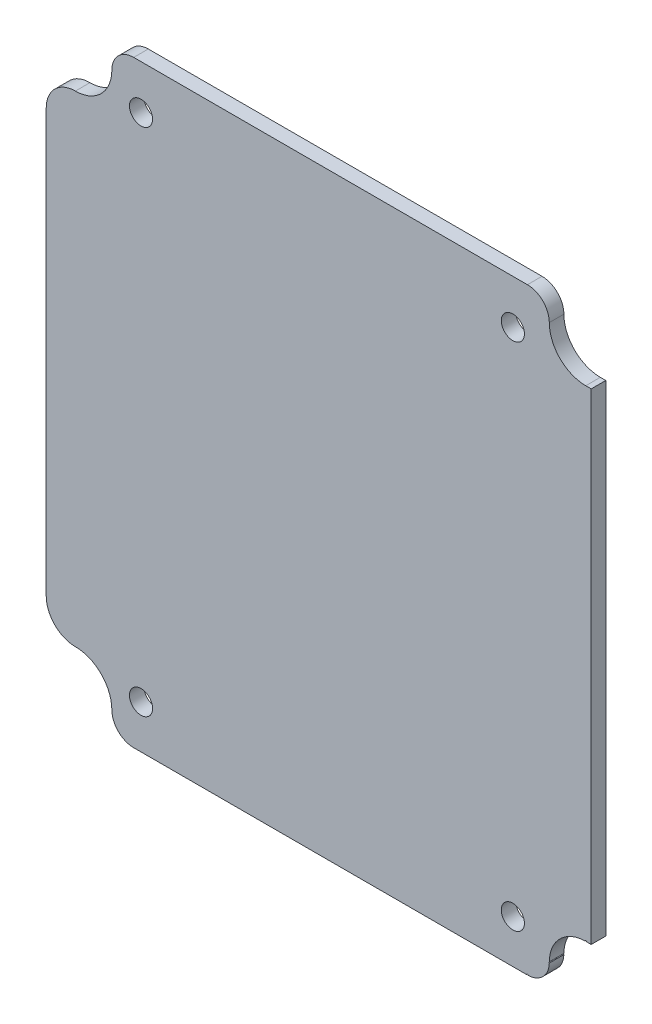
ISO-10303-21;
HEADER;
FILE_DESCRIPTION(('STEP AP214'),'2;1');
FILE_NAME('part.step','',(''),(''),'','','');
FILE_SCHEMA(('AUTOMOTIVE_DESIGN { 1 0 10303 214 1 1 1 1 }'));
ENDSEC;
DATA;
#1=APPLICATION_CONTEXT('core data for automotive mechanical design processes');
#2=APPLICATION_PROTOCOL_DEFINITION('international standard','automotive_design',2000,#1);
#3=PRODUCT_CONTEXT('',#1,'mechanical');
#4=PRODUCT('Part','Part','',(#3));
#5=PRODUCT_RELATED_PRODUCT_CATEGORY('part','',(#4));
#6=PRODUCT_DEFINITION_FORMATION('','',#4);
#7=PRODUCT_DEFINITION_CONTEXT('part definition',#1,'design');
#8=PRODUCT_DEFINITION('design','',#6,#7);
#9=PRODUCT_DEFINITION_SHAPE('','',#8);
#10=(LENGTH_UNIT() NAMED_UNIT(*) SI_UNIT(.MILLI.,.METRE.));
#11=(NAMED_UNIT(*) PLANE_ANGLE_UNIT() SI_UNIT($,.RADIAN.));
#12=(NAMED_UNIT(*) SI_UNIT($,.STERADIAN.) SOLID_ANGLE_UNIT());
#13=UNCERTAINTY_MEASURE_WITH_UNIT(LENGTH_MEASURE(1.E-05),#10,'distance_accuracy_value','');
#14=(GEOMETRIC_REPRESENTATION_CONTEXT(3) GLOBAL_UNCERTAINTY_ASSIGNED_CONTEXT((#13)) GLOBAL_UNIT_ASSIGNED_CONTEXT((#10,
#11,#12)) REPRESENTATION_CONTEXT('',''));
#15=CARTESIAN_POINT('',(0.,0.,0.));
#16=DIRECTION('',(0.,0.,1.));
#17=DIRECTION('',(1.,0.,0.));
#18=AXIS2_PLACEMENT_3D('',#15,#16,#17);
#19=CARTESIAN_POINT('',(-147.399894201283,992.021393519418,2.));
#20=DIRECTION('',(0.,0.,-1.));
#21=DIRECTION('',(-1.,0.,0.));
#22=AXIS2_PLACEMENT_3D('',#19,#20,#21);
#23=CYLINDRICAL_SURFACE('',#22,5.0001057650992);
#24=CARTESIAN_POINT('',(-147.399894201283,992.021393519418,0.));
#25=DIRECTION('',(0.,0.,1.));
#26=DIRECTION('',(1.,0.,0.));
#27=AXIS2_PLACEMENT_3D('',#24,#25,#26);
#28=CIRCLE('',#27,5.0001057650992);
#29=CARTESIAN_POINT('',(-152.399999962952,992.021208296758,0.));
#30=VERTEX_POINT('',#29);
#31=CARTESIAN_POINT('',(-147.399894201882,987.021287754318,0.));
#32=VERTEX_POINT('',#31);
#33=EDGE_CURVE('E215',#30,#32,#28,.T.);
#34=ORIENTED_EDGE('',*,*,#33,.F.);
#35=DIRECTION('',(0.,0.,-1.));
#36=VECTOR('',#35,1.);
#37=CARTESIAN_POINT('',(-152.399999962952,992.021208296758,2.));
#38=LINE('',#37,#36);
#39=CARTESIAN_POINT('',(-152.399999962952,992.021208296758,2.));
#40=VERTEX_POINT('',#39);
#41=EDGE_CURVE('E13',#40,#30,#38,.T.);
#42=ORIENTED_EDGE('',*,*,#41,.F.);
#43=CARTESIAN_POINT('',(-147.399894201283,992.021393519418,2.));
#44=DIRECTION('',(0.,0.,1.));
#45=DIRECTION('',(1.,0.,0.));
#46=AXIS2_PLACEMENT_3D('',#43,#44,#45);
#47=CIRCLE('',#46,5.0001057650992);
#48=CARTESIAN_POINT('',(-147.399894201882,987.021287754318,2.));
#49=VERTEX_POINT('',#48);
#50=EDGE_CURVE('E275',#40,#49,#47,.T.);
#51=ORIENTED_EDGE('',*,*,#50,.T.);
#52=DIRECTION('',(0.,0.,-1.));
#53=VECTOR('',#52,1.);
#54=CARTESIAN_POINT('',(-147.399894201882,987.021287754318,2.));
#55=LINE('',#54,#53);
#56=EDGE_CURVE('E58',#49,#32,#55,.T.);
#57=ORIENTED_EDGE('',*,*,#56,.T.);
#58=EDGE_LOOP('',(#34,#42,#51,#57));
#59=FACE_BOUND('',#58,.T.);
#60=ADVANCED_FACE('F42',(#59),#23,.F.);
#61=CARTESIAN_POINT('',(-155.400063419152,992.021208296758,2.));
#62=DIRECTION('',(0.,0.,-1.));
#63=DIRECTION('',(-1.,0.,0.));
#64=AXIS2_PLACEMENT_3D('',#61,#62,#63);
#65=CYLINDRICAL_SURFACE('',#64,3.00006345620052);
#66=CARTESIAN_POINT('',(-155.400063419152,992.021208296758,0.));
#67=DIRECTION('',(0.,0.,1.));
#68=DIRECTION('',(1.,0.,0.));
#69=AXIS2_PLACEMENT_3D('',#66,#67,#68);
#70=CIRCLE('',#69,3.00006345620052);
#71=CARTESIAN_POINT('',(-155.400063419152,995.021271752959,0.));
#72=VERTEX_POINT('',#71);
#73=EDGE_CURVE('E217',#30,#72,#70,.T.);
#74=ORIENTED_EDGE('',*,*,#73,.T.);
#75=DIRECTION('',(0.,0.,-1.));
#76=VECTOR('',#75,1.);
#77=CARTESIAN_POINT('',(-155.400063419152,995.021271752959,2.));
#78=LINE('',#77,#76);
#79=CARTESIAN_POINT('',(-155.400063419152,995.021271752959,2.));
#80=VERTEX_POINT('',#79);
#81=EDGE_CURVE('E50',#80,#72,#78,.T.);
#82=ORIENTED_EDGE('',*,*,#81,.F.);
#83=CARTESIAN_POINT('',(-155.400063419152,992.021208296758,2.));
#84=DIRECTION('',(0.,0.,1.));
#85=DIRECTION('',(1.,0.,0.));
#86=AXIS2_PLACEMENT_3D('',#83,#84,#85);
#87=CIRCLE('',#86,3.00006345620052);
#88=EDGE_CURVE('E335',#40,#80,#87,.T.);
#89=ORIENTED_EDGE('',*,*,#88,.F.);
#90=ORIENTED_EDGE('',*,*,#41,.T.);
#91=EDGE_LOOP('',(#74,#82,#89,#90));
#92=FACE_BOUND('',#91,.T.);
#93=ADVANCED_FACE('F381',(#92),#65,.T.);
#94=CARTESIAN_POINT('',(0.,995.021271752959,2.));
#95=DIRECTION('',(0.,-1.,0.));
#96=DIRECTION('',(0.,0.,-1.));
#97=AXIS2_PLACEMENT_3D('',#94,#95,#96);
#98=PLANE('',#97);
#99=DIRECTION('',(-1.,0.,0.));
#100=VECTOR('',#99,1.);
#101=CARTESIAN_POINT('',(0.,995.021271752959,0.));
#102=LINE('',#101,#100);
#103=CARTESIAN_POINT('',(-209.399816511665,995.021271752959,0.));
#104=VERTEX_POINT('',#103);
#105=EDGE_CURVE('E219',#72,#104,#102,.T.);
#106=ORIENTED_EDGE('',*,*,#105,.T.);
#107=DIRECTION('',(0.,0.,-1.));
#108=VECTOR('',#107,1.);
#109=CARTESIAN_POINT('',(-209.399816511665,995.021271752959,2.));
#110=LINE('',#109,#108);
#111=CARTESIAN_POINT('',(-209.399816511665,995.021271752959,2.));
#112=VERTEX_POINT('',#111);
#113=EDGE_CURVE('E306',#112,#104,#110,.T.);
#114=ORIENTED_EDGE('',*,*,#113,.F.);
#115=DIRECTION('',(-1.,0.,0.));
#116=VECTOR('',#115,1.);
#117=CARTESIAN_POINT('',(0.,995.021271752959,2.));
#118=LINE('',#117,#116);
#119=EDGE_CURVE('E315',#80,#112,#118,.T.);
#120=ORIENTED_EDGE('',*,*,#119,.F.);
#121=ORIENTED_EDGE('',*,*,#81,.T.);
#122=EDGE_LOOP('',(#106,#114,#120,#121));
#123=FACE_BOUND('',#122,.T.);
#124=ADVANCED_FACE('F313',(#123),#98,.F.);
#125=CARTESIAN_POINT('',(-209.399816511665,992.021208293899,2.));
#126=DIRECTION('',(0.,0.,-1.));
#127=DIRECTION('',(-1.,0.,0.));
#128=AXIS2_PLACEMENT_3D('',#125,#126,#127);
#129=CYLINDRICAL_SURFACE('',#128,3.00006345905935);
#130=CARTESIAN_POINT('',(-209.399816511665,992.021208293899,0.));
#131=DIRECTION('',(0.,0.,1.));
#132=DIRECTION('',(1.,0.,0.));
#133=AXIS2_PLACEMENT_3D('',#130,#131,#132);
#134=CIRCLE('',#133,3.00006345905935);
#135=CARTESIAN_POINT('',(-212.399879965007,992.021393513716,0.));
#136=VERTEX_POINT('',#135);
#137=EDGE_CURVE('E221',#104,#136,#134,.T.);
#138=ORIENTED_EDGE('',*,*,#137,.T.);
#139=DIRECTION('',(0.,0.,-1.));
#140=VECTOR('',#139,1.);
#141=CARTESIAN_POINT('',(-212.399879965007,992.021393513716,2.));
#142=LINE('',#141,#140);
#143=CARTESIAN_POINT('',(-212.399879965007,992.021393513716,2.));
#144=VERTEX_POINT('',#143);
#145=EDGE_CURVE('E304',#144,#136,#142,.T.);
#146=ORIENTED_EDGE('',*,*,#145,.F.);
#147=CARTESIAN_POINT('',(-209.399816511665,992.021208293899,2.));
#148=DIRECTION('',(0.,0.,1.));
#149=DIRECTION('',(1.,0.,0.));
#150=AXIS2_PLACEMENT_3D('',#147,#148,#149);
#151=CIRCLE('',#150,3.00006345905935);
#152=EDGE_CURVE('E329',#112,#144,#151,.T.);
#153=ORIENTED_EDGE('',*,*,#152,.F.);
#154=ORIENTED_EDGE('',*,*,#113,.T.);
#155=EDGE_LOOP('',(#138,#146,#153,#154));
#156=FACE_BOUND('',#155,.T.);
#157=ADVANCED_FACE('F326',(#156),#129,.T.);
#158=CARTESIAN_POINT('',(-217.39998572906,992.021393513716,2.));
#159=DIRECTION('',(0.,0.,-1.));
#160=DIRECTION('',(-1.,0.,0.));
#161=AXIS2_PLACEMENT_3D('',#158,#159,#160);
#162=CYLINDRICAL_SURFACE('',#161,5.00010576405378);
#163=CARTESIAN_POINT('',(-217.39998572906,992.021393513716,0.));
#164=DIRECTION('',(0.,0.,1.));
#165=DIRECTION('',(1.,0.,0.));
#166=AXIS2_PLACEMENT_3D('',#163,#164,#165);
#167=CIRCLE('',#166,5.00010576405378);
#168=CARTESIAN_POINT('',(-217.399777355045,987.021287754004,0.));
#169=VERTEX_POINT('',#168);
#170=EDGE_CURVE('E224',#169,#136,#167,.T.);
#171=ORIENTED_EDGE('',*,*,#170,.F.);
#172=DIRECTION('',(0.,0.,-1.));
#173=VECTOR('',#172,1.);
#174=CARTESIAN_POINT('',(-217.399777355045,987.021287754004,2.));
#175=LINE('',#174,#173);
#176=CARTESIAN_POINT('',(-217.399777355045,987.021287754004,2.));
#177=VERTEX_POINT('',#176);
#178=EDGE_CURVE('E302',#177,#169,#175,.T.);
#179=ORIENTED_EDGE('',*,*,#178,.F.);
#180=CARTESIAN_POINT('',(-217.39998572906,992.021393513716,2.));
#181=DIRECTION('',(0.,0.,1.));
#182=DIRECTION('',(1.,0.,0.));
#183=AXIS2_PLACEMENT_3D('',#180,#181,#182);
#184=CIRCLE('',#183,5.00010576405378);
#185=EDGE_CURVE('E331',#177,#144,#184,.T.);
#186=ORIENTED_EDGE('',*,*,#185,.T.);
#187=ORIENTED_EDGE('',*,*,#145,.T.);
#188=EDGE_LOOP('',(#171,#179,#186,#187));
#189=FACE_BOUND('',#188,.T.);
#190=ADVANCED_FACE('F392',(#189),#162,.F.);
#191=CARTESIAN_POINT('',(-217.399777355045,983.021203144638,2.));
#192=DIRECTION('',(0.,0.,-1.));
#193=DIRECTION('',(-1.,0.,0.));
#194=AXIS2_PLACEMENT_3D('',#191,#192,#193);
#195=CYLINDRICAL_SURFACE('',#194,4.0000846093656);
#196=CARTESIAN_POINT('',(-217.399777355045,983.021203144638,0.));
#197=DIRECTION('',(0.,0.,1.));
#198=DIRECTION('',(1.,0.,0.));
#199=AXIS2_PLACEMENT_3D('',#196,#197,#198);
#200=CIRCLE('',#199,4.0000846093656);
#201=CARTESIAN_POINT('',(-221.39986196441,983.021203144638,0.));
#202=VERTEX_POINT('',#201);
#203=EDGE_CURVE('E227',#169,#202,#200,.T.);
#204=ORIENTED_EDGE('',*,*,#203,.T.);
#205=DIRECTION('',(0.,0.,-1.));
#206=VECTOR('',#205,1.);
#207=CARTESIAN_POINT('',(-221.39986196441,983.021203144638,2.));
#208=LINE('',#207,#206);
#209=CARTESIAN_POINT('',(-221.39986196441,983.021203144638,2.));
#210=VERTEX_POINT('',#209);
#211=EDGE_CURVE('E299',#210,#202,#208,.T.);
#212=ORIENTED_EDGE('',*,*,#211,.F.);
#213=CARTESIAN_POINT('',(-217.399777355045,983.021203144638,2.));
#214=DIRECTION('',(0.,0.,1.));
#215=DIRECTION('',(1.,0.,0.));
#216=AXIS2_PLACEMENT_3D('',#213,#214,#215);
#217=CIRCLE('',#216,4.0000846093656);
#218=EDGE_CURVE('E333',#177,#210,#217,.T.);
#219=ORIENTED_EDGE('',*,*,#218,.F.);
#220=ORIENTED_EDGE('',*,*,#178,.T.);
#221=EDGE_LOOP('',(#204,#212,#219,#220));
#222=FACE_BOUND('',#221,.T.);
#223=ADVANCED_FACE('F395',(#222),#195,.T.);
#224=CARTESIAN_POINT('',(-221.39986196441,0.,2.));
#225=DIRECTION('',(1.,0.,0.));
#226=DIRECTION('',(0.,0.,-1.));
#227=AXIS2_PLACEMENT_3D('',#224,#225,#226);
#228=PLANE('',#227);
#229=DIRECTION('',(0.,-1.,0.));
#230=VECTOR('',#229,1.);
#231=CARTESIAN_POINT('',(-221.39986196441,0.,0.));
#232=LINE('',#231,#230);
#233=CARTESIAN_POINT('',(-221.39986196441,925.021411752362,0.));
#234=VERTEX_POINT('',#233);
#235=EDGE_CURVE('E229',#202,#234,#232,.T.);
#236=ORIENTED_EDGE('',*,*,#235,.T.);
#237=DIRECTION('',(0.,0.,-1.));
#238=VECTOR('',#237,1.);
#239=CARTESIAN_POINT('',(-221.39986196441,925.021411752362,2.));
#240=LINE('',#239,#238);
#241=CARTESIAN_POINT('',(-221.39986196441,925.021411752362,2.));
#242=VERTEX_POINT('',#241);
#243=EDGE_CURVE('E296',#242,#234,#240,.T.);
#244=ORIENTED_EDGE('',*,*,#243,.F.);
#245=DIRECTION('',(0.,-1.,0.));
#246=VECTOR('',#245,1.);
#247=CARTESIAN_POINT('',(-221.39986196441,0.,2.));
#248=LINE('',#247,#246);
#249=EDGE_CURVE('E340',#210,#242,#248,.T.);
#250=ORIENTED_EDGE('',*,*,#249,.F.);
#251=ORIENTED_EDGE('',*,*,#211,.T.);
#252=EDGE_LOOP('',(#236,#244,#250,#251));
#253=FACE_BOUND('',#252,.T.);
#254=ADVANCED_FACE('F399',(#253),#228,.F.);
#255=CARTESIAN_POINT('',(-217.399777356005,925.021504359014,2.));
#256=DIRECTION('',(0.,0.,-1.));
#257=DIRECTION('',(-1.,0.,0.));
#258=AXIS2_PLACEMENT_3D('',#255,#256,#257);
#259=CYLINDRICAL_SURFACE('',#258,4.00008460947704);
#260=CARTESIAN_POINT('',(-217.399777356005,925.021504359014,0.));
#261=DIRECTION('',(0.,0.,1.));
#262=DIRECTION('',(1.,0.,0.));
#263=AXIS2_PLACEMENT_3D('',#260,#261,#262);
#264=CIRCLE('',#263,4.00008460947704);
#265=CARTESIAN_POINT('',(-217.399735119561,921.02141974976,0.));
#266=VERTEX_POINT('',#265);
#267=EDGE_CURVE('E231',#234,#266,#264,.T.);
#268=ORIENTED_EDGE('',*,*,#267,.T.);
#269=DIRECTION('',(0.,0.,-1.));
#270=VECTOR('',#269,1.);
#271=CARTESIAN_POINT('',(-217.399735119561,921.02141974976,2.));
#272=LINE('',#271,#270);
#273=CARTESIAN_POINT('',(-217.399735119561,921.02141974976,2.));
#274=VERTEX_POINT('',#273);
#275=EDGE_CURVE('E294',#274,#266,#272,.T.);
#276=ORIENTED_EDGE('',*,*,#275,.F.);
#277=CARTESIAN_POINT('',(-217.399777356005,925.021504359014,2.));
#278=DIRECTION('',(0.,0.,1.));
#279=DIRECTION('',(1.,0.,0.));
#280=AXIS2_PLACEMENT_3D('',#277,#278,#279);
#281=CIRCLE('',#280,4.00008460947704);
#282=EDGE_CURVE('E342',#242,#274,#281,.T.);
#283=ORIENTED_EDGE('',*,*,#282,.F.);
#284=ORIENTED_EDGE('',*,*,#243,.T.);
#285=EDGE_LOOP('',(#268,#276,#283,#284));
#286=FACE_BOUND('',#285,.T.);
#287=ADVANCED_FACE('F403',(#286),#259,.T.);
#288=CARTESIAN_POINT('',(-217.399985728681,916.021313993188,2.));
#289=DIRECTION('',(0.,0.,-1.));
#290=DIRECTION('',(-1.,0.,0.));
#291=AXIS2_PLACEMENT_3D('',#288,#289,#290);
#292=CYLINDRICAL_SURFACE('',#291,5.00010576285206);
#293=CARTESIAN_POINT('',(-217.399985728681,916.021313993188,0.));
#294=DIRECTION('',(0.,0.,1.));
#295=DIRECTION('',(1.,0.,0.));
#296=AXIS2_PLACEMENT_3D('',#293,#294,#295);
#297=CIRCLE('',#296,5.00010576285206);
#298=CARTESIAN_POINT('',(-212.399879965829,916.021313993188,0.));
#299=VERTEX_POINT('',#298);
#300=EDGE_CURVE('E234',#299,#266,#297,.T.);
#301=ORIENTED_EDGE('',*,*,#300,.F.);
#302=DIRECTION('',(0.,0.,-1.));
#303=VECTOR('',#302,1.);
#304=CARTESIAN_POINT('',(-212.399879965829,916.021313993188,2.));
#305=LINE('',#304,#303);
#306=CARTESIAN_POINT('',(-212.399879965829,916.021313993188,2.));
#307=VERTEX_POINT('',#306);
#308=EDGE_CURVE('E292',#307,#299,#305,.T.);
#309=ORIENTED_EDGE('',*,*,#308,.F.);
#310=CARTESIAN_POINT('',(-217.399985728681,916.021313993188,2.));
#311=DIRECTION('',(0.,0.,1.));
#312=DIRECTION('',(1.,0.,0.));
#313=AXIS2_PLACEMENT_3D('',#310,#311,#312);
#314=CIRCLE('',#313,5.00010576285206);
#315=EDGE_CURVE('E344',#307,#274,#314,.T.);
#316=ORIENTED_EDGE('',*,*,#315,.T.);
#317=ORIENTED_EDGE('',*,*,#275,.T.);
#318=EDGE_LOOP('',(#301,#309,#316,#317));
#319=FACE_BOUND('',#318,.T.);
#320=ADVANCED_FACE('F407',(#319),#292,.F.);
#321=CARTESIAN_POINT('',(-209.399816515346,916.021499209199,2.));
#322=DIRECTION('',(0.,0.,-1.));
#323=DIRECTION('',(-1.,0.,0.));
#324=AXIS2_PLACEMENT_3D('',#321,#322,#323);
#325=CYLINDRICAL_SURFACE('',#324,3.00006345620041);
#326=CARTESIAN_POINT('',(-209.399816515346,916.021499209199,0.));
#327=DIRECTION('',(0.,0.,1.));
#328=DIRECTION('',(1.,0.,0.));
#329=AXIS2_PLACEMENT_3D('',#326,#327,#328);
#330=CIRCLE('',#329,3.00006345620041);
#331=CARTESIAN_POINT('',(-209.399816515346,913.021435752998,0.));
#332=VERTEX_POINT('',#331);
#333=EDGE_CURVE('E237',#299,#332,#330,.T.);
#334=ORIENTED_EDGE('',*,*,#333,.T.);
#335=DIRECTION('',(0.,0.,-1.));
#336=VECTOR('',#335,1.);
#337=CARTESIAN_POINT('',(-209.399816515346,913.021435752998,2.));
#338=LINE('',#337,#336);
#339=CARTESIAN_POINT('',(-209.399816515346,913.021435752998,2.));
#340=VERTEX_POINT('',#339);
#341=EDGE_CURVE('E289',#340,#332,#338,.T.);
#342=ORIENTED_EDGE('',*,*,#341,.F.);
#343=CARTESIAN_POINT('',(-209.399816515346,916.021499209199,2.));
#344=DIRECTION('',(0.,0.,1.));
#345=DIRECTION('',(1.,0.,0.));
#346=AXIS2_PLACEMENT_3D('',#343,#344,#345);
#347=CIRCLE('',#346,3.00006345620041);
#348=EDGE_CURVE('E347',#307,#340,#347,.T.);
#349=ORIENTED_EDGE('',*,*,#348,.F.);
#350=ORIENTED_EDGE('',*,*,#308,.T.);
#351=EDGE_LOOP('',(#334,#342,#349,#350));
#352=FACE_BOUND('',#351,.T.);
#353=ADVANCED_FACE('F411',(#352),#325,.T.);
#354=CARTESIAN_POINT('',(0.,913.021435752998,2.));
#355=DIRECTION('',(0.,1.,0.));
#356=DIRECTION('',(0.,0.,1.));
#357=AXIS2_PLACEMENT_3D('',#354,#355,#356);
#358=PLANE('',#357);
#359=DIRECTION('',(1.,0.,0.));
#360=VECTOR('',#359,1.);
#361=CARTESIAN_POINT('',(0.,913.021435752998,0.));
#362=LINE('',#361,#360);
#363=CARTESIAN_POINT('',(-155.506885764341,913.021435752998,0.));
#364=VERTEX_POINT('',#363);
#365=EDGE_CURVE('E239',#332,#364,#362,.T.);
#366=ORIENTED_EDGE('',*,*,#365,.T.);
#367=DIRECTION('',(0.,0.,-1.));
#368=VECTOR('',#367,1.);
#369=CARTESIAN_POINT('',(-155.506885764341,913.021435752998,2.));
#370=LINE('',#369,#368);
#371=CARTESIAN_POINT('',(-155.506885764341,913.021435752998,2.));
#372=VERTEX_POINT('',#371);
#373=EDGE_CURVE('E287',#372,#364,#370,.T.);
#374=ORIENTED_EDGE('',*,*,#373,.F.);
#375=DIRECTION('',(1.,0.,0.));
#376=VECTOR('',#375,1.);
#377=CARTESIAN_POINT('',(0.,913.021435752998,2.));
#378=LINE('',#377,#376);
#379=EDGE_CURVE('E349',#340,#372,#378,.T.);
#380=ORIENTED_EDGE('',*,*,#379,.F.);
#381=ORIENTED_EDGE('',*,*,#341,.T.);
#382=EDGE_LOOP('',(#366,#374,#380,#381));
#383=FACE_BOUND('',#382,.T.);
#384=ADVANCED_FACE('F415',(#383),#358,.F.);
#385=CARTESIAN_POINT('',(-155.400063417116,913.021435752998,2.));
#386=DIRECTION('',(0.,0.,-1.));
#387=DIRECTION('',(-1.,0.,0.));
#388=AXIS2_PLACEMENT_3D('',#385,#386,#387);
#389=CYLINDRICAL_SURFACE('',#388,0.106822347225807);
#390=CARTESIAN_POINT('',(-155.400063417116,913.021435752998,0.));
#391=DIRECTION('',(0.,0.,1.));
#392=DIRECTION('',(1.,0.,0.));
#393=AXIS2_PLACEMENT_3D('',#390,#391,#392);
#394=CIRCLE('',#393,0.106822347225807);
#395=CARTESIAN_POINT('',(-155.293258000394,913.023337548414,0.));
#396=VERTEX_POINT('',#395);
#397=EDGE_CURVE('E242',#396,#364,#394,.T.);
#398=ORIENTED_EDGE('',*,*,#397,.F.);
#399=DIRECTION('',(0.,0.,-1.));
#400=VECTOR('',#399,1.);
#401=CARTESIAN_POINT('',(-155.293258000394,913.023337548414,2.));
#402=LINE('',#401,#400);
#403=CARTESIAN_POINT('',(-155.293258000394,913.023337548414,2.));
#404=VERTEX_POINT('',#403);
#405=EDGE_CURVE('E285',#404,#396,#402,.T.);
#406=ORIENTED_EDGE('',*,*,#405,.F.);
#407=CARTESIAN_POINT('',(-155.400063417116,913.021435752998,2.));
#408=DIRECTION('',(0.,0.,1.));
#409=DIRECTION('',(1.,0.,0.));
#410=AXIS2_PLACEMENT_3D('',#407,#408,#409);
#411=CIRCLE('',#410,0.106822347225807);
#412=EDGE_CURVE('E351',#404,#372,#411,.T.);
#413=ORIENTED_EDGE('',*,*,#412,.T.);
#414=ORIENTED_EDGE('',*,*,#373,.T.);
#415=EDGE_LOOP('',(#398,#406,#413,#414));
#416=FACE_BOUND('',#415,.T.);
#417=ADVANCED_FACE('F419',(#416),#389,.F.);
#418=CARTESIAN_POINT('',(-155.400063417116,916.021499211655,2.));
#419=DIRECTION('',(0.,0.,-1.));
#420=DIRECTION('',(-1.,0.,0.));
#421=AXIS2_PLACEMENT_3D('',#418,#419,#420);
#422=CYLINDRICAL_SURFACE('',#421,3.00006345865735);
#423=CARTESIAN_POINT('',(-155.400063417116,916.021499211655,0.));
#424=DIRECTION('',(0.,0.,1.));
#425=DIRECTION('',(1.,0.,0.));
#426=AXIS2_PLACEMENT_3D('',#423,#424,#425);
#427=CIRCLE('',#426,3.00006345865735);
#428=CARTESIAN_POINT('',(-152.400955638209,915.945780743135,0.));
#429=VERTEX_POINT('',#428);
#430=EDGE_CURVE('E245',#396,#429,#427,.T.);
#431=ORIENTED_EDGE('',*,*,#430,.T.);
#432=DIRECTION('',(0.,0.,-1.));
#433=VECTOR('',#432,1.);
#434=CARTESIAN_POINT('',(-152.400955638209,915.945780743135,2.));
#435=LINE('',#434,#433);
#436=CARTESIAN_POINT('',(-152.400955638209,915.945780743135,2.));
#437=VERTEX_POINT('',#436);
#438=EDGE_CURVE('E283',#437,#429,#435,.T.);
#439=ORIENTED_EDGE('',*,*,#438,.F.);
#440=CARTESIAN_POINT('',(-155.400063417116,916.021499211655,2.));
#441=DIRECTION('',(0.,0.,1.));
#442=DIRECTION('',(1.,0.,0.));
#443=AXIS2_PLACEMENT_3D('',#440,#441,#442);
#444=CIRCLE('',#443,3.00006345865735);
#445=EDGE_CURVE('E354',#404,#437,#444,.T.);
#446=ORIENTED_EDGE('',*,*,#445,.F.);
#447=ORIENTED_EDGE('',*,*,#405,.T.);
#448=EDGE_LOOP('',(#431,#439,#446,#447));
#449=FACE_BOUND('',#448,.T.);
#450=ADVANCED_FACE('F423',(#449),#422,.T.);
#451=CARTESIAN_POINT('',(-152.399999964176,916.021313988301,2.));
#452=DIRECTION('',(0.,0.,-1.));
#453=DIRECTION('',(-1.,0.,0.));
#454=AXIS2_PLACEMENT_3D('',#451,#452,#453);
#455=CYLINDRICAL_SURFACE('',#454,0.075539290691752);
#456=CARTESIAN_POINT('',(-152.399999964176,916.021313988301,0.));
#457=DIRECTION('',(0.,0.,1.));
#458=DIRECTION('',(1.,0.,0.));
#459=AXIS2_PLACEMENT_3D('',#456,#457,#458);
#460=CIRCLE('',#459,0.075539290691752);
#461=CARTESIAN_POINT('',(-152.399429357802,916.096851123848,0.));
#462=VERTEX_POINT('',#461);
#463=EDGE_CURVE('E248',#462,#429,#460,.T.);
#464=ORIENTED_EDGE('',*,*,#463,.F.);
#465=DIRECTION('',(0.,0.,-1.));
#466=VECTOR('',#465,1.);
#467=CARTESIAN_POINT('',(-152.399429357802,916.096851123848,2.));
#468=LINE('',#467,#466);
#469=CARTESIAN_POINT('',(-152.399429357802,916.096851123848,2.));
#470=VERTEX_POINT('',#469);
#471=EDGE_CURVE('E281',#470,#462,#468,.T.);
#472=ORIENTED_EDGE('',*,*,#471,.F.);
#473=CARTESIAN_POINT('',(-152.399999964176,916.021313988301,2.));
#474=DIRECTION('',(0.,0.,1.));
#475=DIRECTION('',(1.,0.,0.));
#476=AXIS2_PLACEMENT_3D('',#473,#474,#475);
#477=CIRCLE('',#476,0.075539290691752);
#478=EDGE_CURVE('E356',#470,#437,#477,.T.);
#479=ORIENTED_EDGE('',*,*,#478,.T.);
#480=ORIENTED_EDGE('',*,*,#438,.T.);
#481=EDGE_LOOP('',(#464,#472,#479,#480));
#482=FACE_BOUND('',#481,.T.);
#483=ADVANCED_FACE('F427',(#482),#455,.F.);
#484=CARTESIAN_POINT('',(-147.399894201838,916.021313988301,2.));
#485=DIRECTION('',(0.,0.,-1.));
#486=DIRECTION('',(-1.,0.,0.));
#487=AXIS2_PLACEMENT_3D('',#484,#485,#486);
#488=CYLINDRICAL_SURFACE('',#487,5.00010576233846);
#489=CARTESIAN_POINT('',(-147.399894201838,916.021313988301,0.));
#490=DIRECTION('',(0.,0.,1.));
#491=DIRECTION('',(1.,0.,0.));
#492=AXIS2_PLACEMENT_3D('',#489,#490,#491);
#493=CIRCLE('',#492,5.00010576233846);
#494=CARTESIAN_POINT('',(-147.506710494528,921.020278672532,0.));
#495=VERTEX_POINT('',#494);
#496=EDGE_CURVE('E251',#495,#462,#493,.T.);
#497=ORIENTED_EDGE('',*,*,#496,.F.);
#498=DIRECTION('',(0.,0.,-1.));
#499=VECTOR('',#498,1.);
#500=CARTESIAN_POINT('',(-147.506710494528,921.020278672532,2.));
#501=LINE('',#500,#499);
#502=CARTESIAN_POINT('',(-147.506710494528,921.020278672532,2.));
#503=VERTEX_POINT('',#502);
#504=EDGE_CURVE('E279',#503,#495,#501,.T.);
#505=ORIENTED_EDGE('',*,*,#504,.F.);
#506=CARTESIAN_POINT('',(-147.399894201838,916.021313988301,2.));
#507=DIRECTION('',(0.,0.,1.));
#508=DIRECTION('',(1.,0.,0.));
#509=AXIS2_PLACEMENT_3D('',#506,#507,#508);
#510=CIRCLE('',#509,5.00010576233846);
#511=EDGE_CURVE('E359',#503,#470,#510,.T.);
#512=ORIENTED_EDGE('',*,*,#511,.T.);
#513=ORIENTED_EDGE('',*,*,#471,.T.);
#514=EDGE_LOOP('',(#497,#505,#512,#513));
#515=FACE_BOUND('',#514,.T.);
#516=ADVANCED_FACE('F431',(#515),#488,.F.);
#517=CARTESIAN_POINT('',(-147.399894201838,921.02141975064,2.));
#518=DIRECTION('',(0.,0.,-1.));
#519=DIRECTION('',(-1.,0.,0.));
#520=AXIS2_PLACEMENT_3D('',#517,#518,#519);
#521=CYLINDRICAL_SURFACE('',#520,0.106822387369631);
#522=CARTESIAN_POINT('',(-147.399894201838,921.02141975064,0.));
#523=DIRECTION('',(0.,0.,1.));
#524=DIRECTION('',(1.,0.,0.));
#525=AXIS2_PLACEMENT_3D('',#522,#523,#524);
#526=CIRCLE('',#525,0.106822387369631);
#527=CARTESIAN_POINT('',(-147.293071814468,921.02141975064,0.));
#528=VERTEX_POINT('',#527);
#529=EDGE_CURVE('E254',#528,#495,#526,.T.);
#530=ORIENTED_EDGE('',*,*,#529,.F.);
#531=DIRECTION('',(0.,0.,-1.));
#532=VECTOR('',#531,1.);
#533=CARTESIAN_POINT('',(-147.293071814468,921.02141975064,2.));
#534=LINE('',#533,#532);
#535=CARTESIAN_POINT('',(-147.293071814468,921.02141975064,2.));
#536=VERTEX_POINT('',#535);
#537=EDGE_CURVE('E195',#536,#528,#534,.T.);
#538=ORIENTED_EDGE('',*,*,#537,.F.);
#539=CARTESIAN_POINT('',(-147.399894201838,921.02141975064,2.));
#540=DIRECTION('',(0.,0.,1.));
#541=DIRECTION('',(1.,0.,0.));
#542=AXIS2_PLACEMENT_3D('',#539,#540,#541);
#543=CIRCLE('',#542,0.106822387369631);
#544=EDGE_CURVE('E185',#536,#503,#543,.T.);
#545=ORIENTED_EDGE('',*,*,#544,.T.);
#546=ORIENTED_EDGE('',*,*,#504,.T.);
#547=EDGE_LOOP('',(#530,#538,#545,#546));
#548=FACE_BOUND('',#547,.T.);
#549=ADVANCED_FACE('F363',(#548),#521,.F.);
#550=CARTESIAN_POINT('',(0.,921.02141975064,2.));
#551=DIRECTION('',(0.,1.,0.));
#552=DIRECTION('',(0.,0.,1.));
#553=AXIS2_PLACEMENT_3D('',#550,#551,#552);
#554=PLANE('',#553);
#555=DIRECTION('',(1.,0.,0.));
#556=VECTOR('',#555,1.);
#557=CARTESIAN_POINT('',(0.,921.02141975064,0.));
#558=LINE('',#557,#556);
#559=CARTESIAN_POINT('',(-146.653910016137,921.02141975064,0.));
#560=VERTEX_POINT('',#559);
#561=EDGE_CURVE('E192',#528,#560,#558,.T.);
#562=ORIENTED_EDGE('',*,*,#561,.T.);
#563=DIRECTION('',(0.,0.,-1.));
#564=VECTOR('',#563,1.);
#565=CARTESIAN_POINT('',(-146.653910016137,921.02141975064,2.));
#566=LINE('',#565,#564);
#567=CARTESIAN_POINT('',(-146.653910016137,921.02141975064,2.));
#568=VERTEX_POINT('',#567);
#569=EDGE_CURVE('E189',#568,#560,#566,.T.);
#570=ORIENTED_EDGE('',*,*,#569,.F.);
#571=DIRECTION('',(1.,0.,0.));
#572=VECTOR('',#571,1.);
#573=CARTESIAN_POINT('',(0.,921.02141975064,2.));
#574=LINE('',#573,#572);
#575=EDGE_CURVE('E175',#536,#568,#574,.T.);
#576=ORIENTED_EDGE('',*,*,#575,.F.);
#577=ORIENTED_EDGE('',*,*,#537,.T.);
#578=EDGE_LOOP('',(#562,#570,#576,#577));
#579=FACE_BOUND('',#578,.T.);
#580=ADVANCED_FACE('F190',(#579),#554,.F.);
#581=CARTESIAN_POINT('',(-146.659744239696,0.000929019216953833,2.));
#582=DIRECTION('',(0.999999999979937,-6.33452091268366E-06,0.));
#583=DIRECTION('',(6.33452091268366E-06,0.999999999979937,0.));
#584=AXIS2_PLACEMENT_3D('',#581,#582,#583);
#585=PLANE('',#584);
#586=DIRECTION('',(-6.33452091268366E-06,-0.999999999979937,0.));
#587=VECTOR('',#586,1.);
#588=CARTESIAN_POINT('',(-146.659744239696,0.000929019216953833,0.));
#589=LINE('',#588,#587);
#590=CARTESIAN_POINT('',(-146.653491938593,987.021287754318,0.));
#591=VERTEX_POINT('',#590);
#592=EDGE_CURVE('E258',#591,#560,#589,.T.);
#593=ORIENTED_EDGE('',*,*,#592,.F.);
#594=DIRECTION('',(0.,0.,-1.));
#595=VECTOR('',#594,1.);
#596=CARTESIAN_POINT('',(-146.653491938593,987.021287754318,2.));
#597=LINE('',#596,#595);
#598=CARTESIAN_POINT('',(-146.653491938593,987.021287754318,2.));
#599=VERTEX_POINT('',#598);
#600=EDGE_CURVE('E116',#599,#591,#597,.T.);
#601=ORIENTED_EDGE('',*,*,#600,.F.);
#602=DIRECTION('',(-6.33452091268366E-06,-0.999999999979937,0.));
#603=VECTOR('',#602,1.);
#604=CARTESIAN_POINT('',(-146.659744239696,0.000929019216953833,2.));
#605=LINE('',#604,#603);
#606=EDGE_CURVE('E182',#599,#568,#605,.T.);
#607=ORIENTED_EDGE('',*,*,#606,.T.);
#608=ORIENTED_EDGE('',*,*,#569,.T.);
#609=EDGE_LOOP('',(#593,#601,#607,#608));
#610=FACE_BOUND('',#609,.T.);
#611=ADVANCED_FACE('F197',(#610),#585,.T.);
#612=CARTESIAN_POINT('',(-208.39988796441,918.965401326115,2.));
#613=DIRECTION('',(0.,0.,-1.));
#614=DIRECTION('',(-1.,0.,0.));
#615=AXIS2_PLACEMENT_3D('',#612,#613,#614);
#616=CYLINDRICAL_SURFACE('',#615,1.58749682500001);
#617=CARTESIAN_POINT('',(-208.39988796441,918.965401326115,2.));
#618=DIRECTION('',(0.,0.,1.));
#619=DIRECTION('',(1.,0.,0.));
#620=AXIS2_PLACEMENT_3D('',#617,#618,#619);
#621=CIRCLE('',#620,1.58749682500001);
#622=CARTESIAN_POINT('',(-206.81239113941,918.965401326115,2.));
#623=VERTEX_POINT('',#622);
#624=EDGE_CURVE('E209',#623,#623,#621,.T.);
#625=ORIENTED_EDGE('',*,*,#624,.T.);
#626=EDGE_LOOP('',(#625));
#627=FACE_BOUND('',#626,.T.);
#628=CARTESIAN_POINT('',(-208.39988796441,918.965401326115,0.));
#629=DIRECTION('',(0.,0.,1.));
#630=DIRECTION('',(1.,0.,0.));
#631=AXIS2_PLACEMENT_3D('',#628,#629,#630);
#632=CIRCLE('',#631,1.58749682500001);
#633=CARTESIAN_POINT('',(-206.81239113941,918.965401326115,0.));
#634=VERTEX_POINT('',#633);
#635=EDGE_CURVE('E269',#634,#634,#632,.T.);
#636=ORIENTED_EDGE('',*,*,#635,.F.);
#637=EDGE_LOOP('',(#636));
#638=FACE_BOUND('',#637,.T.);
#639=ADVANCED_FACE('F440',(#627,#638),#616,.F.);
#640=CARTESIAN_POINT('',(-157.39998996441,988.965261326115,2.));
#641=DIRECTION('',(0.,0.,-1.));
#642=DIRECTION('',(-1.,0.,0.));
#643=AXIS2_PLACEMENT_3D('',#640,#641,#642);
#644=CYLINDRICAL_SURFACE('',#643,1.58749682500001);
#645=CARTESIAN_POINT('',(-157.39998996441,988.965261326115,2.));
#646=DIRECTION('',(0.,0.,1.));
#647=DIRECTION('',(1.,0.,0.));
#648=AXIS2_PLACEMENT_3D('',#645,#646,#647);
#649=CIRCLE('',#648,1.58749682500001);
#650=CARTESIAN_POINT('',(-155.81249313941,988.965261326115,2.));
#651=VERTEX_POINT('',#650);
#652=EDGE_CURVE('E206',#651,#651,#649,.T.);
#653=ORIENTED_EDGE('',*,*,#652,.T.);
#654=EDGE_LOOP('',(#653));
#655=FACE_BOUND('',#654,.T.);
#656=CARTESIAN_POINT('',(-157.39998996441,988.965261326115,0.));
#657=DIRECTION('',(0.,0.,1.));
#658=DIRECTION('',(1.,0.,0.));
#659=AXIS2_PLACEMENT_3D('',#656,#657,#658);
#660=CIRCLE('',#659,1.58749682500001);
#661=CARTESIAN_POINT('',(-155.81249313941,988.965261326115,0.));
#662=VERTEX_POINT('',#661);
#663=EDGE_CURVE('E266',#662,#662,#660,.T.);
#664=ORIENTED_EDGE('',*,*,#663,.F.);
#665=EDGE_LOOP('',(#664));
#666=FACE_BOUND('',#665,.T.);
#667=ADVANCED_FACE('F376',(#655,#666),#644,.F.);
#668=CARTESIAN_POINT('',(-208.39988796441,988.965261326115,2.));
#669=DIRECTION('',(0.,0.,-1.));
#670=DIRECTION('',(-1.,0.,0.));
#671=AXIS2_PLACEMENT_3D('',#668,#669,#670);
#672=CYLINDRICAL_SURFACE('',#671,1.58749682500001);
#673=CARTESIAN_POINT('',(-208.39988796441,988.965261326115,2.));
#674=DIRECTION('',(0.,0.,1.));
#675=DIRECTION('',(1.,0.,0.));
#676=AXIS2_PLACEMENT_3D('',#673,#674,#675);
#677=CIRCLE('',#676,1.58749682500001);
#678=CARTESIAN_POINT('',(-206.81239113941,988.965261326115,2.));
#679=VERTEX_POINT('',#678);
#680=EDGE_CURVE('E200',#679,#679,#677,.T.);
#681=ORIENTED_EDGE('',*,*,#680,.T.);
#682=EDGE_LOOP('',(#681));
#683=FACE_BOUND('',#682,.T.);
#684=CARTESIAN_POINT('',(-208.39988796441,988.965261326115,0.));
#685=DIRECTION('',(0.,0.,1.));
#686=DIRECTION('',(1.,0.,0.));
#687=AXIS2_PLACEMENT_3D('',#684,#685,#686);
#688=CIRCLE('',#687,1.58749682500001);
#689=CARTESIAN_POINT('',(-206.81239113941,988.965261326115,0.));
#690=VERTEX_POINT('',#689);
#691=EDGE_CURVE('E263',#690,#690,#688,.T.);
#692=ORIENTED_EDGE('',*,*,#691,.F.);
#693=EDGE_LOOP('',(#692));
#694=FACE_BOUND('',#693,.T.);
#695=ADVANCED_FACE('F368',(#683,#694),#672,.F.);
#696=CARTESIAN_POINT('',(0.,987.021287754318,2.));
#697=DIRECTION('',(0.,1.,0.));
#698=DIRECTION('',(0.,0.,1.));
#699=AXIS2_PLACEMENT_3D('',#696,#697,#698);
#700=PLANE('',#699);
#701=DIRECTION('',(1.,0.,0.));
#702=VECTOR('',#701,1.);
#703=CARTESIAN_POINT('',(0.,987.021287754318,0.));
#704=LINE('',#703,#702);
#705=EDGE_CURVE('E260',#32,#591,#704,.T.);
#706=ORIENTED_EDGE('',*,*,#705,.F.);
#707=ORIENTED_EDGE('',*,*,#56,.F.);
#708=DIRECTION('',(1.,0.,0.));
#709=VECTOR('',#708,1.);
#710=CARTESIAN_POINT('',(0.,987.021287754318,2.));
#711=LINE('',#710,#709);
#712=EDGE_CURVE('E198',#49,#599,#711,.T.);
#713=ORIENTED_EDGE('',*,*,#712,.T.);
#714=ORIENTED_EDGE('',*,*,#600,.T.);
#715=EDGE_LOOP('',(#706,#707,#713,#714));
#716=FACE_BOUND('',#715,.T.);
#717=ADVANCED_FACE('F365',(#716),#700,.T.);
#718=CARTESIAN_POINT('',(-157.39998996441,918.965401326115,2.));
#719=DIRECTION('',(0.,0.,-1.));
#720=DIRECTION('',(-1.,0.,0.));
#721=AXIS2_PLACEMENT_3D('',#718,#719,#720);
#722=CYLINDRICAL_SURFACE('',#721,1.58749682500001);
#723=CARTESIAN_POINT('',(-157.39998996441,918.965401326115,2.));
#724=DIRECTION('',(0.,0.,1.));
#725=DIRECTION('',(1.,0.,0.));
#726=AXIS2_PLACEMENT_3D('',#723,#724,#725);
#727=CIRCLE('',#726,1.58749682500001);
#728=CARTESIAN_POINT('',(-155.81249313941,918.965401326115,2.));
#729=VERTEX_POINT('',#728);
#730=EDGE_CURVE('E212',#729,#729,#727,.T.);
#731=ORIENTED_EDGE('',*,*,#730,.T.);
#732=EDGE_LOOP('',(#731));
#733=FACE_BOUND('',#732,.T.);
#734=CARTESIAN_POINT('',(-157.39998996441,918.965401326115,0.));
#735=DIRECTION('',(0.,0.,1.));
#736=DIRECTION('',(1.,0.,0.));
#737=AXIS2_PLACEMENT_3D('',#734,#735,#736);
#738=CIRCLE('',#737,1.58749682500001);
#739=CARTESIAN_POINT('',(-155.81249313941,918.965401326115,0.));
#740=VERTEX_POINT('',#739);
#741=EDGE_CURVE('E272',#740,#740,#738,.T.);
#742=ORIENTED_EDGE('',*,*,#741,.F.);
#743=EDGE_LOOP('',(#742));
#744=FACE_BOUND('',#743,.T.);
#745=ADVANCED_FACE('F367',(#733,#744),#722,.F.);
#746=CARTESIAN_POINT('',(0.,0.,2.));
#747=DIRECTION('',(0.,0.,1.));
#748=DIRECTION('',(1.,0.,0.));
#749=AXIS2_PLACEMENT_3D('',#746,#747,#748);
#750=PLANE('',#749);
#751=ORIENTED_EDGE('',*,*,#50,.F.);
#752=ORIENTED_EDGE('',*,*,#88,.T.);
#753=ORIENTED_EDGE('',*,*,#119,.T.);
#754=ORIENTED_EDGE('',*,*,#152,.T.);
#755=ORIENTED_EDGE('',*,*,#185,.F.);
#756=ORIENTED_EDGE('',*,*,#218,.T.);
#757=ORIENTED_EDGE('',*,*,#249,.T.);
#758=ORIENTED_EDGE('',*,*,#282,.T.);
#759=ORIENTED_EDGE('',*,*,#315,.F.);
#760=ORIENTED_EDGE('',*,*,#348,.T.);
#761=ORIENTED_EDGE('',*,*,#379,.T.);
#762=ORIENTED_EDGE('',*,*,#412,.F.);
#763=ORIENTED_EDGE('',*,*,#445,.T.);
#764=ORIENTED_EDGE('',*,*,#478,.F.);
#765=ORIENTED_EDGE('',*,*,#511,.F.);
#766=ORIENTED_EDGE('',*,*,#544,.F.);
#767=ORIENTED_EDGE('',*,*,#575,.T.);
#768=ORIENTED_EDGE('',*,*,#606,.F.);
#769=ORIENTED_EDGE('',*,*,#712,.F.);
#770=EDGE_LOOP('',(#751,#752,#753,#754,#755,#756,#757,#758,#759,#760,#761,#762,#763,#764,#765,
#766,#767,#768,#769));
#771=FACE_BOUND('',#770,.T.);
#772=ORIENTED_EDGE('',*,*,#680,.F.);
#773=EDGE_LOOP('',(#772));
#774=FACE_BOUND('',#773,.T.);
#775=ORIENTED_EDGE('',*,*,#652,.F.);
#776=EDGE_LOOP('',(#775));
#777=FACE_BOUND('',#776,.T.);
#778=ORIENTED_EDGE('',*,*,#624,.F.);
#779=EDGE_LOOP('',(#778));
#780=FACE_BOUND('',#779,.T.);
#781=ORIENTED_EDGE('',*,*,#730,.F.);
#782=EDGE_LOOP('',(#781));
#783=FACE_BOUND('',#782,.T.);
#784=ADVANCED_FACE('F178',(#771,#774,#777,#780,#783),#750,.T.);
#785=CARTESIAN_POINT('',(0.,0.,0.));
#786=DIRECTION('',(0.,0.,1.));
#787=DIRECTION('',(1.,0.,0.));
#788=AXIS2_PLACEMENT_3D('',#785,#786,#787);
#789=PLANE('',#788);
#790=ORIENTED_EDGE('',*,*,#33,.T.);
#791=ORIENTED_EDGE('',*,*,#705,.T.);
#792=ORIENTED_EDGE('',*,*,#592,.T.);
#793=ORIENTED_EDGE('',*,*,#561,.F.);
#794=ORIENTED_EDGE('',*,*,#529,.T.);
#795=ORIENTED_EDGE('',*,*,#496,.T.);
#796=ORIENTED_EDGE('',*,*,#463,.T.);
#797=ORIENTED_EDGE('',*,*,#430,.F.);
#798=ORIENTED_EDGE('',*,*,#397,.T.);
#799=ORIENTED_EDGE('',*,*,#365,.F.);
#800=ORIENTED_EDGE('',*,*,#333,.F.);
#801=ORIENTED_EDGE('',*,*,#300,.T.);
#802=ORIENTED_EDGE('',*,*,#267,.F.);
#803=ORIENTED_EDGE('',*,*,#235,.F.);
#804=ORIENTED_EDGE('',*,*,#203,.F.);
#805=ORIENTED_EDGE('',*,*,#170,.T.);
#806=ORIENTED_EDGE('',*,*,#137,.F.);
#807=ORIENTED_EDGE('',*,*,#105,.F.);
#808=ORIENTED_EDGE('',*,*,#73,.F.);
#809=EDGE_LOOP('',(#790,#791,#792,#793,#794,#795,#796,#797,#798,#799,#800,#801,#802,#803,#804,
#805,#806,#807,#808));
#810=FACE_BOUND('',#809,.T.);
#811=ORIENTED_EDGE('',*,*,#691,.T.);
#812=EDGE_LOOP('',(#811));
#813=FACE_BOUND('',#812,.T.);
#814=ORIENTED_EDGE('',*,*,#663,.T.);
#815=EDGE_LOOP('',(#814));
#816=FACE_BOUND('',#815,.T.);
#817=ORIENTED_EDGE('',*,*,#635,.T.);
#818=EDGE_LOOP('',(#817));
#819=FACE_BOUND('',#818,.T.);
#820=ORIENTED_EDGE('',*,*,#741,.T.);
#821=EDGE_LOOP('',(#820));
#822=FACE_BOUND('',#821,.T.);
#823=ADVANCED_FACE('F320',(#810,#813,#816,#819,#822),#789,.F.);
#824=CLOSED_SHELL('',(#60,#93,#124,#157,#190,#223,#254,#287,#320,#353,#384,#417,#450,#483,#516,
#549,#580,#611,#639,#667,#695,#717,#745,#784,#823));
#825=MANIFOLD_SOLID_BREP('B2',#824);
#826=ADVANCED_BREP_SHAPE_REPRESENTATION('',(#18,#825),#14);
#827=SHAPE_DEFINITION_REPRESENTATION(#9,#826);
ENDSEC;
END-ISO-10303-21;
